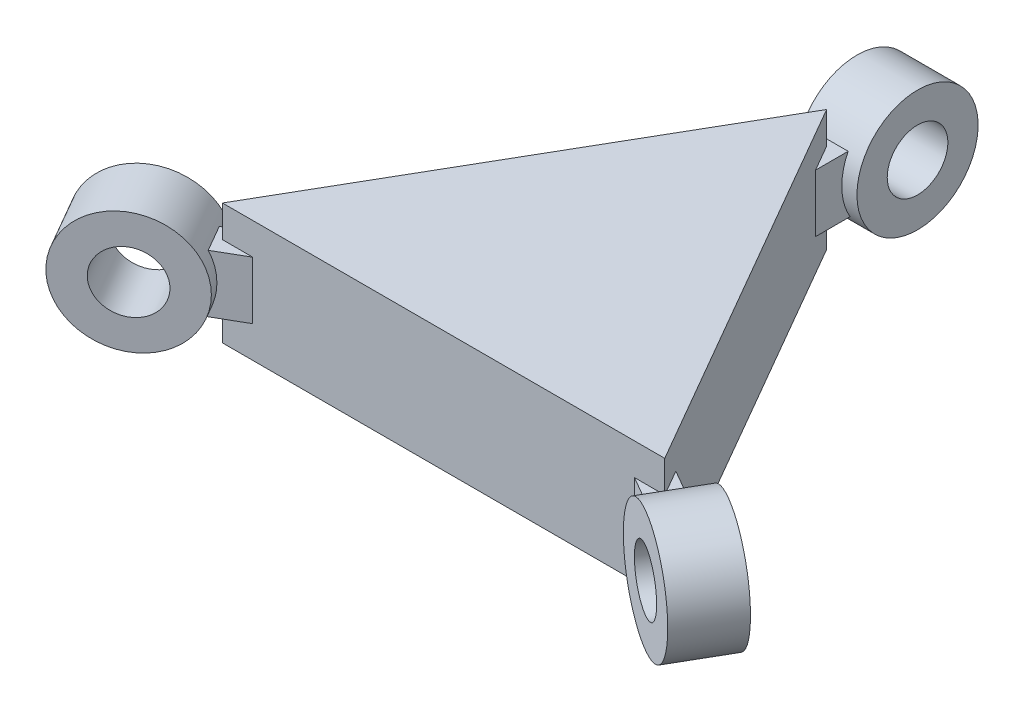
ISO-10303-21;
HEADER;
FILE_DESCRIPTION(('STEP AP214'),'2;1');
FILE_NAME('part.step','',(''),(''),'','','');
FILE_SCHEMA(('AUTOMOTIVE_DESIGN { 1 0 10303 214 1 1 1 1 }'));
ENDSEC;
DATA;
#1=APPLICATION_CONTEXT('core data for automotive mechanical design processes');
#2=APPLICATION_PROTOCOL_DEFINITION('international standard','automotive_design',2000,#1);
#3=PRODUCT_CONTEXT('',#1,'mechanical');
#4=PRODUCT('Part','Part','',(#3));
#5=PRODUCT_RELATED_PRODUCT_CATEGORY('part','',(#4));
#6=PRODUCT_DEFINITION_FORMATION('','',#4);
#7=PRODUCT_DEFINITION_CONTEXT('part definition',#1,'design');
#8=PRODUCT_DEFINITION('design','',#6,#7);
#9=PRODUCT_DEFINITION_SHAPE('','',#8);
#10=(LENGTH_UNIT() NAMED_UNIT(*) SI_UNIT(.MILLI.,.METRE.));
#11=(NAMED_UNIT(*) PLANE_ANGLE_UNIT() SI_UNIT($,.RADIAN.));
#12=(NAMED_UNIT(*) SI_UNIT($,.STERADIAN.) SOLID_ANGLE_UNIT());
#13=UNCERTAINTY_MEASURE_WITH_UNIT(LENGTH_MEASURE(1.E-05),#10,'distance_accuracy_value','');
#14=(GEOMETRIC_REPRESENTATION_CONTEXT(3) GLOBAL_UNCERTAINTY_ASSIGNED_CONTEXT((#13)) GLOBAL_UNIT_ASSIGNED_CONTEXT((#10,
#11,#12)) REPRESENTATION_CONTEXT('',''));
#15=CARTESIAN_POINT('',(0.,0.,0.));
#16=DIRECTION('',(0.,0.,1.));
#17=DIRECTION('',(1.,0.,0.));
#18=AXIS2_PLACEMENT_3D('',#15,#16,#17);
#19=CARTESIAN_POINT('',(0.,20.,-69.9999999999994));
#20=DIRECTION('',(0.866025403784436,0.,0.500000000000004));
#21=DIRECTION('',(0.500000000000004,0.,-0.866025403784436));
#22=AXIS2_PLACEMENT_3D('',#19,#20,#21);
#23=PLANE('',#22);
#24=DIRECTION('',(0.,1.,0.));
#25=VECTOR('',#24,1.);
#26=CARTESIAN_POINT('',(-33.9999999999997,20.,-11.1102725426589));
#27=LINE('',#26,#25);
#28=CARTESIAN_POINT('',(-33.9999999999997,5.24611498566727,-11.1102725426589));
#29=VERTEX_POINT('',#28);
#30=CARTESIAN_POINT('',(-33.9999999999997,14.7538850143327,-11.1102725426589));
#31=VERTEX_POINT('',#30);
#32=EDGE_CURVE('E12',#29,#31,#27,.T.);
#33=ORIENTED_EDGE('',*,*,#32,.T.);
#34=DIRECTION('',(-0.500000000000004,0.,0.866025403784436));
#35=VECTOR('',#34,1.);
#36=CARTESIAN_POINT('',(0.,14.7538850143327,-69.9999999999994));
#37=LINE('',#36,#35);
#38=CARTESIAN_POINT('',(-36.4999999999999,14.7538850143327,-6.78014552373624));
#39=VERTEX_POINT('',#38);
#40=EDGE_CURVE('E234',#31,#39,#37,.T.);
#41=ORIENTED_EDGE('',*,*,#40,.T.);
#42=DIRECTION('',(0.,-1.,0.));
#43=VECTOR('',#42,1.);
#44=CARTESIAN_POINT('',(-36.4999999999999,20.,-6.78014552373624));
#45=LINE('',#44,#43);
#46=CARTESIAN_POINT('',(-36.4999999999999,20.,-6.78014552373624));
#47=VERTEX_POINT('',#46);
#48=EDGE_CURVE('E348',#47,#39,#45,.T.);
#49=ORIENTED_EDGE('',*,*,#48,.F.);
#50=DIRECTION('',(-0.500000000000004,0.,0.866025403784436));
#51=VECTOR('',#50,1.);
#52=CARTESIAN_POINT('',(0.,20.,-69.9999999999994));
#53=LINE('',#52,#51);
#54=CARTESIAN_POINT('',(0.,20.,-69.9999999999994));
#55=VERTEX_POINT('',#54);
#56=EDGE_CURVE('E324',#55,#47,#53,.T.);
#57=ORIENTED_EDGE('',*,*,#56,.F.);
#58=DIRECTION('',(0.,-1.,0.));
#59=VECTOR('',#58,1.);
#60=CARTESIAN_POINT('',(0.,20.,-69.9999999999994));
#61=LINE('',#60,#59);
#62=CARTESIAN_POINT('',(0.,14.7538850143327,-69.9999999999995));
#63=VERTEX_POINT('',#62);
#64=EDGE_CURVE('E340',#55,#63,#61,.T.);
#65=ORIENTED_EDGE('',*,*,#64,.T.);
#66=DIRECTION('',(-0.500000000000004,0.,0.866025403784436));
#67=VECTOR('',#66,1.);
#68=CARTESIAN_POINT('',(0.,14.7538850143327,-69.9999999999994));
#69=LINE('',#68,#67);
#70=CARTESIAN_POINT('',(-2.5,14.7538850143327,-65.6698729810773));
#71=VERTEX_POINT('',#70);
#72=EDGE_CURVE('E320',#63,#71,#69,.T.);
#73=ORIENTED_EDGE('',*,*,#72,.T.);
#74=DIRECTION('',(0.,-1.,0.));
#75=VECTOR('',#74,1.);
#76=CARTESIAN_POINT('',(-2.5,20.,-65.6698729810773));
#77=LINE('',#76,#75);
#78=CARTESIAN_POINT('',(-2.5,5.24611498566727,-65.6698729810773));
#79=VERTEX_POINT('',#78);
#80=EDGE_CURVE('E360',#71,#79,#77,.T.);
#81=ORIENTED_EDGE('',*,*,#80,.T.);
#82=DIRECTION('',(0.500000000000004,0.,-0.866025403784436));
#83=VECTOR('',#82,1.);
#84=CARTESIAN_POINT('',(0.,5.24611498566727,-69.9999999999994));
#85=LINE('',#84,#83);
#86=CARTESIAN_POINT('',(0.,5.24611498566727,-69.9999999999995));
#87=VERTEX_POINT('',#86);
#88=EDGE_CURVE('E317',#79,#87,#85,.T.);
#89=ORIENTED_EDGE('',*,*,#88,.T.);
#90=CARTESIAN_POINT('',(0.,0.,-69.9999999999994));
#91=VERTEX_POINT('',#90);
#92=EDGE_CURVE('E332',#87,#91,#61,.T.);
#93=ORIENTED_EDGE('',*,*,#92,.T.);
#94=DIRECTION('',(-0.500000000000004,0.,0.866025403784436));
#95=VECTOR('',#94,1.);
#96=CARTESIAN_POINT('',(0.,0.,-69.9999999999994));
#97=LINE('',#96,#95);
#98=CARTESIAN_POINT('',(-36.4999999999999,0.,-6.78014552373624));
#99=VERTEX_POINT('',#98);
#100=EDGE_CURVE('E323',#91,#99,#97,.T.);
#101=ORIENTED_EDGE('',*,*,#100,.T.);
#102=CARTESIAN_POINT('',(-36.4999999999999,5.24611498566727,-6.78014552373624));
#103=VERTEX_POINT('',#102);
#104=EDGE_CURVE('E347',#103,#99,#45,.T.);
#105=ORIENTED_EDGE('',*,*,#104,.F.);
#106=DIRECTION('',(0.500000000000004,0.,-0.866025403784436));
#107=VECTOR('',#106,1.);
#108=CARTESIAN_POINT('',(0.,5.24611498566727,-69.9999999999994));
#109=LINE('',#108,#107);
#110=EDGE_CURVE('E54',#103,#29,#109,.T.);
#111=ORIENTED_EDGE('',*,*,#110,.T.);
#112=EDGE_LOOP('',(#33,#41,#49,#57,#65,#73,#81,#89,#93,#101,#105,#111));
#113=FACE_BOUND('',#112,.T.);
#114=ADVANCED_FACE('F40',(#113),#23,.F.);
#115=CARTESIAN_POINT('',(-36.4999999999999,20.,-6.78014552373624));
#116=DIRECTION('',(0.,0.,-1.));
#117=DIRECTION('',(-1.,0.,0.));
#118=AXIS2_PLACEMENT_3D('',#115,#116,#117);
#119=PLANE('',#118);
#120=ORIENTED_EDGE('',*,*,#48,.T.);
#121=DIRECTION('',(1.,0.,0.));
#122=VECTOR('',#121,1.);
#123=CARTESIAN_POINT('',(-36.4999999999999,14.7538850143327,-6.78014552373624));
#124=LINE('',#123,#122);
#125=CARTESIAN_POINT('',(-31.5000000000004,14.7538850143327,-6.78014552373624));
#126=VERTEX_POINT('',#125);
#127=EDGE_CURVE('E47',#39,#126,#124,.T.);
#128=ORIENTED_EDGE('',*,*,#127,.T.);
#129=DIRECTION('',(0.,1.,0.));
#130=VECTOR('',#129,1.);
#131=CARTESIAN_POINT('',(-31.5000000000004,20.,-6.78014552373624));
#132=LINE('',#131,#130);
#133=CARTESIAN_POINT('',(-31.5000000000004,5.24611498566727,-6.78014552373624));
#134=VERTEX_POINT('',#133);
#135=EDGE_CURVE('E375',#134,#126,#132,.T.);
#136=ORIENTED_EDGE('',*,*,#135,.F.);
#137=DIRECTION('',(-1.,0.,0.));
#138=VECTOR('',#137,1.);
#139=CARTESIAN_POINT('',(-36.4999999999999,5.24611498566727,-6.78014552373624));
#140=LINE('',#139,#138);
#141=EDGE_CURVE('E373',#134,#103,#140,.T.);
#142=ORIENTED_EDGE('',*,*,#141,.T.);
#143=ORIENTED_EDGE('',*,*,#104,.T.);
#144=DIRECTION('',(1.,0.,0.));
#145=VECTOR('',#144,1.);
#146=CARTESIAN_POINT('',(-36.4999999999999,0.,-6.78014552373624));
#147=LINE('',#146,#145);
#148=CARTESIAN_POINT('',(36.5000000000001,0.,-6.78014552373624));
#149=VERTEX_POINT('',#148);
#150=EDGE_CURVE('E335',#99,#149,#147,.T.);
#151=ORIENTED_EDGE('',*,*,#150,.T.);
#152=DIRECTION('',(0.,-1.,0.));
#153=VECTOR('',#152,1.);
#154=CARTESIAN_POINT('',(36.5000000000001,20.,-6.78014552373624));
#155=LINE('',#154,#153);
#156=CARTESIAN_POINT('',(36.5000000000001,5.24611498566727,-6.78014552373624));
#157=VERTEX_POINT('',#156);
#158=EDGE_CURVE('E343',#157,#149,#155,.T.);
#159=ORIENTED_EDGE('',*,*,#158,.F.);
#160=DIRECTION('',(-1.,0.,0.));
#161=VECTOR('',#160,1.);
#162=CARTESIAN_POINT('',(-36.4999999999999,5.24611498566727,-6.78014552373624));
#163=LINE('',#162,#161);
#164=CARTESIAN_POINT('',(31.5000000000004,5.24611498566727,-6.78014552373624));
#165=VERTEX_POINT('',#164);
#166=EDGE_CURVE('E62',#157,#165,#163,.T.);
#167=ORIENTED_EDGE('',*,*,#166,.T.);
#168=DIRECTION('',(0.,-1.,0.));
#169=VECTOR('',#168,1.);
#170=CARTESIAN_POINT('',(31.5000000000004,20.,-6.78014552373624));
#171=LINE('',#170,#169);
#172=CARTESIAN_POINT('',(31.5000000000004,14.7538850143327,-6.78014552373624));
#173=VERTEX_POINT('',#172);
#174=EDGE_CURVE('E371',#173,#165,#171,.T.);
#175=ORIENTED_EDGE('',*,*,#174,.F.);
#176=DIRECTION('',(1.,0.,0.));
#177=VECTOR('',#176,1.);
#178=CARTESIAN_POINT('',(-36.4999999999999,14.7538850143327,-6.78014552373624));
#179=LINE('',#178,#177);
#180=CARTESIAN_POINT('',(36.5000000000001,14.7538850143327,-6.78014552373624));
#181=VERTEX_POINT('',#180);
#182=EDGE_CURVE('E276',#173,#181,#179,.T.);
#183=ORIENTED_EDGE('',*,*,#182,.T.);
#184=CARTESIAN_POINT('',(36.5000000000001,20.,-6.78014552373624));
#185=VERTEX_POINT('',#184);
#186=EDGE_CURVE('E344',#185,#181,#155,.T.);
#187=ORIENTED_EDGE('',*,*,#186,.F.);
#188=DIRECTION('',(1.,0.,0.));
#189=VECTOR('',#188,1.);
#190=CARTESIAN_POINT('',(-36.4999999999999,20.,-6.78014552373624));
#191=LINE('',#190,#189);
#192=EDGE_CURVE('E327',#47,#185,#191,.T.);
#193=ORIENTED_EDGE('',*,*,#192,.F.);
#194=EDGE_LOOP('',(#120,#128,#136,#142,#143,#151,#159,#167,#175,#183,#187,#193));
#195=FACE_BOUND('',#194,.T.);
#196=ADVANCED_FACE('F379',(#195),#119,.F.);
#197=CARTESIAN_POINT('',(36.5000000000001,20.,-6.78014552373624));
#198=DIRECTION('',(-0.866025403784435,0.,0.500000000000006));
#199=DIRECTION('',(0.500000000000006,0.,0.866025403784435));
#200=AXIS2_PLACEMENT_3D('',#197,#198,#199);
#201=PLANE('',#200);
#202=ORIENTED_EDGE('',*,*,#186,.T.);
#203=DIRECTION('',(-0.500000000000006,0.,-0.866025403784435));
#204=VECTOR('',#203,1.);
#205=CARTESIAN_POINT('',(36.5000000000001,14.7538850143327,-6.78014552373624));
#206=LINE('',#205,#204);
#207=CARTESIAN_POINT('',(33.9999999999999,14.7538850143327,-11.1102725426587));
#208=VERTEX_POINT('',#207);
#209=EDGE_CURVE('E368',#181,#208,#206,.T.);
#210=ORIENTED_EDGE('',*,*,#209,.T.);
#211=DIRECTION('',(0.,-1.,0.));
#212=VECTOR('',#211,1.);
#213=CARTESIAN_POINT('',(33.9999999999999,20.,-11.1102725426587));
#214=LINE('',#213,#212);
#215=CARTESIAN_POINT('',(33.9999999999999,5.24611498566727,-11.1102725426587));
#216=VERTEX_POINT('',#215);
#217=EDGE_CURVE('E365',#208,#216,#214,.T.);
#218=ORIENTED_EDGE('',*,*,#217,.T.);
#219=DIRECTION('',(0.500000000000006,0.,0.866025403784435));
#220=VECTOR('',#219,1.);
#221=CARTESIAN_POINT('',(36.5000000000001,5.24611498566727,-6.78014552373624));
#222=LINE('',#221,#220);
#223=EDGE_CURVE('E363',#216,#157,#222,.T.);
#224=ORIENTED_EDGE('',*,*,#223,.T.);
#225=ORIENTED_EDGE('',*,*,#158,.T.);
#226=DIRECTION('',(-0.500000000000006,0.,-0.866025403784435));
#227=VECTOR('',#226,1.);
#228=CARTESIAN_POINT('',(36.5000000000001,0.,-6.78014552373624));
#229=LINE('',#228,#227);
#230=EDGE_CURVE('E328',#149,#91,#229,.T.);
#231=ORIENTED_EDGE('',*,*,#230,.T.);
#232=ORIENTED_EDGE('',*,*,#92,.F.);
#233=DIRECTION('',(0.500000000000006,0.,0.866025403784435));
#234=VECTOR('',#233,1.);
#235=CARTESIAN_POINT('',(36.5000000000001,5.24611498566727,-6.78014552373624));
#236=LINE('',#235,#234);
#237=CARTESIAN_POINT('',(2.5,5.24611498566727,-65.6698729810773));
#238=VERTEX_POINT('',#237);
#239=EDGE_CURVE('E351',#87,#238,#236,.T.);
#240=ORIENTED_EDGE('',*,*,#239,.T.);
#241=DIRECTION('',(0.,-1.,0.));
#242=VECTOR('',#241,1.);
#243=CARTESIAN_POINT('',(2.5,20.,-65.6698729810773));
#244=LINE('',#243,#242);
#245=CARTESIAN_POINT('',(2.49999999999999,14.7538850143327,-65.6698729810773));
#246=VERTEX_POINT('',#245);
#247=EDGE_CURVE('E354',#246,#238,#244,.T.);
#248=ORIENTED_EDGE('',*,*,#247,.F.);
#249=DIRECTION('',(-0.500000000000006,0.,-0.866025403784435));
#250=VECTOR('',#249,1.);
#251=CARTESIAN_POINT('',(36.5000000000001,14.7538850143327,-6.78014552373624));
#252=LINE('',#251,#250);
#253=EDGE_CURVE('E357',#246,#63,#252,.T.);
#254=ORIENTED_EDGE('',*,*,#253,.T.);
#255=ORIENTED_EDGE('',*,*,#64,.F.);
#256=DIRECTION('',(-0.500000000000006,0.,-0.866025403784435));
#257=VECTOR('',#256,1.);
#258=CARTESIAN_POINT('',(36.5000000000001,20.,-6.78014552373624));
#259=LINE('',#258,#257);
#260=EDGE_CURVE('E330',#185,#55,#259,.T.);
#261=ORIENTED_EDGE('',*,*,#260,.F.);
#262=EDGE_LOOP('',(#202,#210,#218,#224,#225,#231,#232,#240,#248,#254,#255,#261));
#263=FACE_BOUND('',#262,.T.);
#264=ADVANCED_FACE('F396',(#263),#201,.F.);
#265=CARTESIAN_POINT('',(0.,20.,0.));
#266=DIRECTION('',(0.,1.,0.));
#267=DIRECTION('',(0.,0.,1.));
#268=AXIS2_PLACEMENT_3D('',#265,#266,#267);
#269=PLANE('',#268);
#270=ORIENTED_EDGE('',*,*,#56,.T.);
#271=ORIENTED_EDGE('',*,*,#192,.T.);
#272=ORIENTED_EDGE('',*,*,#260,.T.);
#273=EDGE_LOOP('',(#270,#271,#272));
#274=FACE_BOUND('',#273,.T.);
#275=ADVANCED_FACE('F422',(#274),#269,.T.);
#276=CARTESIAN_POINT('',(0.,0.,0.));
#277=DIRECTION('',(0.,1.,0.));
#278=DIRECTION('',(0.,0.,1.));
#279=AXIS2_PLACEMENT_3D('',#276,#277,#278);
#280=PLANE('',#279);
#281=ORIENTED_EDGE('',*,*,#100,.F.);
#282=ORIENTED_EDGE('',*,*,#230,.F.);
#283=ORIENTED_EDGE('',*,*,#150,.F.);
#284=EDGE_LOOP('',(#281,#282,#283));
#285=FACE_BOUND('',#284,.T.);
#286=ADVANCED_FACE('F393',(#285),#280,.F.);
#287=CARTESIAN_POINT('',(-2.5,0.,0.));
#288=DIRECTION('',(-1.,0.,0.));
#289=DIRECTION('',(0.,0.,1.));
#290=AXIS2_PLACEMENT_3D('',#287,#288,#289);
#291=PLANE('',#290);
#292=ORIENTED_EDGE('',*,*,#80,.F.);
#293=DIRECTION('',(0.,0.,-1.));
#294=VECTOR('',#293,1.);
#295=CARTESIAN_POINT('',(-2.5,14.7538850143327,-71.3478751393043));
#296=LINE('',#295,#294);
#297=CARTESIAN_POINT('',(-2.5,14.7538850143327,-71.0529300451838));
#298=VERTEX_POINT('',#297);
#299=EDGE_CURVE('E284',#71,#298,#296,.T.);
#300=ORIENTED_EDGE('',*,*,#299,.T.);
#301=CARTESIAN_POINT('',(-2.5,10.2873495310263,-79.9999999999994));
#302=DIRECTION('',(-1.,0.,0.));
#303=DIRECTION('',(0.,0.,1.));
#304=AXIS2_PLACEMENT_3D('',#301,#302,#303);
#305=CIRCLE('',#304,10.);
#306=CARTESIAN_POINT('',(-2.5,5.27329574242958,-71.3478751393043));
#307=VERTEX_POINT('',#306);
#308=EDGE_CURVE('E307',#298,#307,#305,.F.);
#309=ORIENTED_EDGE('',*,*,#308,.T.);
#310=DIRECTION('',(0.,-1.,0.));
#311=VECTOR('',#310,1.);
#312=CARTESIAN_POINT('',(-2.5,14.7538850143327,-71.3478751393043));
#313=LINE('',#312,#311);
#314=CARTESIAN_POINT('',(-2.5,5.24611498566727,-71.3478751393043));
#315=VERTEX_POINT('',#314);
#316=EDGE_CURVE('E279',#307,#315,#313,.T.);
#317=ORIENTED_EDGE('',*,*,#316,.T.);
#318=DIRECTION('',(0.,0.,1.));
#319=VECTOR('',#318,1.);
#320=CARTESIAN_POINT('',(-2.5,5.24611498566727,-71.3478751393043));
#321=LINE('',#320,#319);
#322=EDGE_CURVE('E281',#315,#79,#321,.T.);
#323=ORIENTED_EDGE('',*,*,#322,.T.);
#324=EDGE_LOOP('',(#292,#300,#309,#317,#323));
#325=FACE_BOUND('',#324,.T.);
#326=ADVANCED_FACE('F444',(#325),#291,.T.);
#327=CARTESIAN_POINT('',(2.5,0.,0.));
#328=DIRECTION('',(-1.,0.,0.));
#329=DIRECTION('',(0.,0.,1.));
#330=AXIS2_PLACEMENT_3D('',#327,#328,#329);
#331=PLANE('',#330);
#332=DIRECTION('',(0.,0.,-1.));
#333=VECTOR('',#332,1.);
#334=CARTESIAN_POINT('',(2.5,14.7538850143327,-71.3478751393043));
#335=LINE('',#334,#333);
#336=CARTESIAN_POINT('',(2.5,14.7538850143327,-71.0529300451838));
#337=VERTEX_POINT('',#336);
#338=EDGE_CURVE('E290',#246,#337,#335,.T.);
#339=ORIENTED_EDGE('',*,*,#338,.F.);
#340=ORIENTED_EDGE('',*,*,#247,.T.);
#341=DIRECTION('',(0.,0.,1.));
#342=VECTOR('',#341,1.);
#343=CARTESIAN_POINT('',(2.5,5.24611498566727,-71.3478751393043));
#344=LINE('',#343,#342);
#345=CARTESIAN_POINT('',(2.5,5.24611498566727,-71.3478751393043));
#346=VERTEX_POINT('',#345);
#347=EDGE_CURVE('E288',#346,#238,#344,.T.);
#348=ORIENTED_EDGE('',*,*,#347,.F.);
#349=DIRECTION('',(0.,-1.,0.));
#350=VECTOR('',#349,1.);
#351=CARTESIAN_POINT('',(2.5,14.7538850143327,-71.3478751393043));
#352=LINE('',#351,#350);
#353=CARTESIAN_POINT('',(2.5,5.27329574242958,-71.3478751393043));
#354=VERTEX_POINT('',#353);
#355=EDGE_CURVE('E286',#354,#346,#352,.T.);
#356=ORIENTED_EDGE('',*,*,#355,.F.);
#357=CARTESIAN_POINT('',(2.5,10.2873495310263,-79.9999999999994));
#358=DIRECTION('',(-1.,0.,0.));
#359=DIRECTION('',(0.,0.,1.));
#360=AXIS2_PLACEMENT_3D('',#357,#358,#359);
#361=CIRCLE('',#360,10.);
#362=EDGE_CURVE('E315',#337,#354,#361,.F.);
#363=ORIENTED_EDGE('',*,*,#362,.F.);
#364=EDGE_LOOP('',(#339,#340,#348,#356,#363));
#365=FACE_BOUND('',#364,.T.);
#366=ADVANCED_FACE('F431',(#365),#331,.F.);
#367=CARTESIAN_POINT('',(2.5,14.7538850143327,-71.3478751393043));
#368=DIRECTION('',(0.,1.,0.));
#369=DIRECTION('',(0.,0.,1.));
#370=AXIS2_PLACEMENT_3D('',#367,#368,#369);
#371=PLANE('',#370);
#372=ORIENTED_EDGE('',*,*,#72,.F.);
#373=ORIENTED_EDGE('',*,*,#253,.F.);
#374=ORIENTED_EDGE('',*,*,#338,.T.);
#375=DIRECTION('',(-1.,0.,0.));
#376=VECTOR('',#375,1.);
#377=CARTESIAN_POINT('',(5.,14.7538850143327,-71.0529300451838));
#378=LINE('',#377,#376);
#379=EDGE_CURVE('E309',#337,#298,#378,.T.);
#380=ORIENTED_EDGE('',*,*,#379,.T.);
#381=ORIENTED_EDGE('',*,*,#299,.F.);
#382=EDGE_LOOP('',(#372,#373,#374,#380,#381));
#383=FACE_BOUND('',#382,.T.);
#384=ADVANCED_FACE('F426',(#383),#371,.T.);
#385=CARTESIAN_POINT('',(2.5,5.24611498566727,-71.3478751393043));
#386=DIRECTION('',(0.,-1.,0.));
#387=DIRECTION('',(0.,0.,-1.));
#388=AXIS2_PLACEMENT_3D('',#385,#386,#387);
#389=PLANE('',#388);
#390=ORIENTED_EDGE('',*,*,#88,.F.);
#391=ORIENTED_EDGE('',*,*,#322,.F.);
#392=DIRECTION('',(-1.,0.,0.));
#393=VECTOR('',#392,1.);
#394=CARTESIAN_POINT('',(2.5,5.24611498566727,-71.3478751393043));
#395=LINE('',#394,#393);
#396=EDGE_CURVE('E292',#346,#315,#395,.T.);
#397=ORIENTED_EDGE('',*,*,#396,.F.);
#398=ORIENTED_EDGE('',*,*,#347,.T.);
#399=ORIENTED_EDGE('',*,*,#239,.F.);
#400=EDGE_LOOP('',(#390,#391,#397,#398,#399));
#401=FACE_BOUND('',#400,.T.);
#402=ADVANCED_FACE('F446',(#401),#389,.T.);
#403=CARTESIAN_POINT('',(5.,10.2873495310263,-79.9999999999994));
#404=DIRECTION('',(-1.,0.,0.));
#405=DIRECTION('',(0.,0.,1.));
#406=AXIS2_PLACEMENT_3D('',#403,#404,#405);
#407=CYLINDRICAL_SURFACE('',#406,10.);
#408=CARTESIAN_POINT('',(5.,10.2873495310263,-79.9999999999994));
#409=DIRECTION('',(-1.,0.,0.));
#410=DIRECTION('',(0.,0.,1.));
#411=AXIS2_PLACEMENT_3D('',#408,#409,#410);
#412=CIRCLE('',#411,10.);
#413=CARTESIAN_POINT('',(5.,10.2873495310263,-69.9999999999994));
#414=VERTEX_POINT('',#413);
#415=EDGE_CURVE('E304',#414,#414,#412,.T.);
#416=ORIENTED_EDGE('',*,*,#415,.T.);
#417=EDGE_LOOP('',(#416));
#418=FACE_BOUND('',#417,.T.);
#419=CARTESIAN_POINT('',(-5.,10.2873495310263,-79.9999999999994));
#420=DIRECTION('',(-1.,0.,0.));
#421=DIRECTION('',(0.,0.,1.));
#422=AXIS2_PLACEMENT_3D('',#419,#420,#421);
#423=CIRCLE('',#422,10.);
#424=CARTESIAN_POINT('',(-5.,10.2873495310263,-69.9999999999994));
#425=VERTEX_POINT('',#424);
#426=EDGE_CURVE('E298',#425,#425,#423,.T.);
#427=ORIENTED_EDGE('',*,*,#426,.F.);
#428=EDGE_LOOP('',(#427));
#429=FACE_BOUND('',#428,.T.);
#430=ORIENTED_EDGE('',*,*,#362,.T.);
#431=DIRECTION('',(-1.,0.,0.));
#432=VECTOR('',#431,1.);
#433=CARTESIAN_POINT('',(5.,5.27329574242958,-71.3478751393043));
#434=LINE('',#433,#432);
#435=EDGE_CURVE('E312',#307,#354,#434,.F.);
#436=ORIENTED_EDGE('',*,*,#435,.F.);
#437=ORIENTED_EDGE('',*,*,#308,.F.);
#438=ORIENTED_EDGE('',*,*,#379,.F.);
#439=EDGE_LOOP('',(#430,#436,#437,#438));
#440=FACE_BOUND('',#439,.T.);
#441=ADVANCED_FACE('F436',(#418,#429,#440),#407,.T.);
#442=CARTESIAN_POINT('',(5.,10.2873495310263,-79.9999999999994));
#443=DIRECTION('',(-1.,0.,0.));
#444=DIRECTION('',(0.,0.,1.));
#445=AXIS2_PLACEMENT_3D('',#442,#443,#444);
#446=PLANE('',#445);
#447=CARTESIAN_POINT('',(5.,10.2873495310263,-79.9999999999994));
#448=DIRECTION('',(-1.,0.,0.));
#449=DIRECTION('',(0.,0.,1.));
#450=AXIS2_PLACEMENT_3D('',#447,#448,#449);
#451=CIRCLE('',#450,5.);
#452=CARTESIAN_POINT('',(5.,10.2873495310263,-74.9999999999994));
#453=VERTEX_POINT('',#452);
#454=EDGE_CURVE('E301',#453,#453,#451,.T.);
#455=ORIENTED_EDGE('',*,*,#454,.T.);
#456=EDGE_LOOP('',(#455));
#457=FACE_BOUND('',#456,.T.);
#458=ORIENTED_EDGE('',*,*,#415,.F.);
#459=EDGE_LOOP('',(#458));
#460=FACE_BOUND('',#459,.T.);
#461=ADVANCED_FACE('F453',(#457,#460),#446,.F.);
#462=CARTESIAN_POINT('',(5.,10.2873495310263,-79.9999999999994));
#463=DIRECTION('',(-1.,0.,0.));
#464=DIRECTION('',(0.,0.,1.));
#465=AXIS2_PLACEMENT_3D('',#462,#463,#464);
#466=CYLINDRICAL_SURFACE('',#465,5.);
#467=ORIENTED_EDGE('',*,*,#454,.F.);
#468=EDGE_LOOP('',(#467));
#469=FACE_BOUND('',#468,.T.);
#470=CARTESIAN_POINT('',(-5.,10.2873495310263,-79.9999999999994));
#471=DIRECTION('',(-1.,0.,0.));
#472=DIRECTION('',(0.,0.,1.));
#473=AXIS2_PLACEMENT_3D('',#470,#471,#472);
#474=CIRCLE('',#473,5.);
#475=CARTESIAN_POINT('',(-5.,10.2873495310263,-74.9999999999994));
#476=VERTEX_POINT('',#475);
#477=EDGE_CURVE('E295',#476,#476,#474,.T.);
#478=ORIENTED_EDGE('',*,*,#477,.T.);
#479=EDGE_LOOP('',(#478));
#480=FACE_BOUND('',#479,.T.);
#481=ADVANCED_FACE('F473',(#469,#480),#466,.F.);
#482=CARTESIAN_POINT('',(-5.,10.2873495310263,-79.9999999999994));
#483=DIRECTION('',(-1.,0.,0.));
#484=DIRECTION('',(0.,0.,1.));
#485=AXIS2_PLACEMENT_3D('',#482,#483,#484);
#486=PLANE('',#485);
#487=ORIENTED_EDGE('',*,*,#426,.T.);
#488=EDGE_LOOP('',(#487));
#489=FACE_BOUND('',#488,.T.);
#490=ORIENTED_EDGE('',*,*,#477,.F.);
#491=EDGE_LOOP('',(#490));
#492=FACE_BOUND('',#491,.T.);
#493=ADVANCED_FACE('F477',(#489,#492),#486,.T.);
#494=CARTESIAN_POINT('',(2.5,14.7538850143327,-71.3478751393043));
#495=DIRECTION('',(0.,0.,-1.));
#496=DIRECTION('',(-1.,0.,0.));
#497=AXIS2_PLACEMENT_3D('',#494,#495,#496);
#498=PLANE('',#497);
#499=ORIENTED_EDGE('',*,*,#316,.F.);
#500=ORIENTED_EDGE('',*,*,#435,.T.);
#501=ORIENTED_EDGE('',*,*,#355,.T.);
#502=ORIENTED_EDGE('',*,*,#396,.T.);
#503=EDGE_LOOP('',(#499,#500,#501,#502));
#504=FACE_BOUND('',#503,.T.);
#505=ADVANCED_FACE('F440',(#504),#498,.T.);
#506=CARTESIAN_POINT('',(-25.3743157584745,0.,-39.6165470368665));
#507=DIRECTION('',(0.499999999999989,0.,-0.866025403784445));
#508=DIRECTION('',(-0.866025403784445,0.,-0.499999999999989));
#509=AXIS2_PLACEMENT_3D('',#506,#507,#508);
#510=PLANE('',#509);
#511=DIRECTION('',(0.866025403784445,0.,0.499999999999989));
#512=VECTOR('',#511,1.);
#513=CARTESIAN_POINT('',(36.4147566182036,14.7538850143327,-3.94260946721517));
#514=LINE('',#513,#512);
#515=CARTESIAN_POINT('',(36.1593266739737,14.7538850143327,-4.09008201427541));
#516=VERTEX_POINT('',#515);
#517=EDGE_CURVE('E248',#173,#516,#514,.T.);
#518=ORIENTED_EDGE('',*,*,#517,.F.);
#519=ORIENTED_EDGE('',*,*,#174,.T.);
#520=DIRECTION('',(-0.866025403784445,0.,-0.499999999999989));
#521=VECTOR('',#520,1.);
#522=CARTESIAN_POINT('',(36.4147566182036,5.24611498566727,-3.94260946721517));
#523=LINE('',#522,#521);
#524=CARTESIAN_POINT('',(36.4147566182036,5.24611498566727,-3.94260946721517));
#525=VERTEX_POINT('',#524);
#526=EDGE_CURVE('E246',#525,#165,#523,.T.);
#527=ORIENTED_EDGE('',*,*,#526,.F.);
#528=DIRECTION('',(0.,-1.,0.));
#529=VECTOR('',#528,1.);
#530=CARTESIAN_POINT('',(36.4147566182036,14.7538850143327,-3.94260946721517));
#531=LINE('',#530,#529);
#532=CARTESIAN_POINT('',(36.4147566182036,5.27329574242958,-3.94260946721517));
#533=VERTEX_POINT('',#532);
#534=EDGE_CURVE('E244',#533,#525,#531,.T.);
#535=ORIENTED_EDGE('',*,*,#534,.F.);
#536=CARTESIAN_POINT('',(43.9077165442806,10.2873495310263,0.383452963132302));
#537=DIRECTION('',(0.499999999999989,0.,-0.866025403784445));
#538=DIRECTION('',(-0.866025403784445,0.,-0.499999999999989));
#539=AXIS2_PLACEMENT_3D('',#536,#537,#538);
#540=CIRCLE('',#539,10.);
#541=EDGE_CURVE('E273',#516,#533,#540,.F.);
#542=ORIENTED_EDGE('',*,*,#541,.F.);
#543=EDGE_LOOP('',(#518,#519,#527,#535,#542));
#544=FACE_BOUND('',#543,.T.);
#545=ADVANCED_FACE('F402',(#544),#510,.F.);
#546=CARTESIAN_POINT('',(-22.8743157584746,0.,-43.9466740557888));
#547=DIRECTION('',(0.499999999999989,0.,-0.866025403784445));
#548=DIRECTION('',(-0.866025403784445,0.,-0.499999999999989));
#549=AXIS2_PLACEMENT_3D('',#546,#547,#548);
#550=PLANE('',#549);
#551=ORIENTED_EDGE('',*,*,#217,.F.);
#552=DIRECTION('',(0.866025403784445,0.,0.499999999999989));
#553=VECTOR('',#552,1.);
#554=CARTESIAN_POINT('',(38.9147566182036,14.7538850143327,-8.2727364861374));
#555=LINE('',#554,#553);
#556=CARTESIAN_POINT('',(38.6593266739737,14.7538850143327,-8.42020903319764));
#557=VERTEX_POINT('',#556);
#558=EDGE_CURVE('E242',#208,#557,#555,.T.);
#559=ORIENTED_EDGE('',*,*,#558,.T.);
#560=CARTESIAN_POINT('',(46.4077165442805,10.2873495310263,-3.94667405578993));
#561=DIRECTION('',(0.499999999999989,0.,-0.866025403784445));
#562=DIRECTION('',(-0.866025403784445,0.,-0.499999999999989));
#563=AXIS2_PLACEMENT_3D('',#560,#561,#562);
#564=CIRCLE('',#563,10.);
#565=CARTESIAN_POINT('',(38.9147566182036,5.27329574242958,-8.2727364861374));
#566=VERTEX_POINT('',#565);
#567=EDGE_CURVE('E265',#557,#566,#564,.F.);
#568=ORIENTED_EDGE('',*,*,#567,.T.);
#569=DIRECTION('',(0.,-1.,0.));
#570=VECTOR('',#569,1.);
#571=CARTESIAN_POINT('',(38.9147566182036,14.7538850143327,-8.2727364861374));
#572=LINE('',#571,#570);
#573=CARTESIAN_POINT('',(38.9147566182036,5.24611498566727,-8.2727364861374));
#574=VERTEX_POINT('',#573);
#575=EDGE_CURVE('E237',#566,#574,#572,.T.);
#576=ORIENTED_EDGE('',*,*,#575,.T.);
#577=DIRECTION('',(-0.866025403784445,0.,-0.499999999999989));
#578=VECTOR('',#577,1.);
#579=CARTESIAN_POINT('',(38.9147566182036,5.24611498566727,-8.2727364861374));
#580=LINE('',#579,#578);
#581=EDGE_CURVE('E239',#574,#216,#580,.T.);
#582=ORIENTED_EDGE('',*,*,#581,.T.);
#583=EDGE_LOOP('',(#551,#559,#568,#576,#582));
#584=FACE_BOUND('',#583,.T.);
#585=ADVANCED_FACE('F485',(#584),#550,.T.);
#586=CARTESIAN_POINT('',(36.4147566182036,14.7538850143327,-3.94260946721517));
#587=DIRECTION('',(0.,1.,0.));
#588=DIRECTION('',(-0.866025403784445,0.,-0.499999999999989));
#589=AXIS2_PLACEMENT_3D('',#586,#587,#588);
#590=PLANE('',#589);
#591=ORIENTED_EDGE('',*,*,#182,.F.);
#592=ORIENTED_EDGE('',*,*,#517,.T.);
#593=DIRECTION('',(0.499999999999989,0.,-0.866025403784445));
#594=VECTOR('',#593,1.);
#595=CARTESIAN_POINT('',(34.9093266739737,14.7538850143327,-1.92501850481431));
#596=LINE('',#595,#594);
#597=EDGE_CURVE('E267',#516,#557,#596,.T.);
#598=ORIENTED_EDGE('',*,*,#597,.T.);
#599=ORIENTED_EDGE('',*,*,#558,.F.);
#600=ORIENTED_EDGE('',*,*,#209,.F.);
#601=EDGE_LOOP('',(#591,#592,#598,#599,#600));
#602=FACE_BOUND('',#601,.T.);
#603=ADVANCED_FACE('F418',(#602),#590,.T.);
#604=CARTESIAN_POINT('',(36.4147566182036,5.24611498566727,-3.94260946721517));
#605=DIRECTION('',(0.,-1.,0.));
#606=DIRECTION('',(0.866025403784445,0.,0.499999999999989));
#607=AXIS2_PLACEMENT_3D('',#604,#605,#606);
#608=PLANE('',#607);
#609=ORIENTED_EDGE('',*,*,#166,.F.);
#610=ORIENTED_EDGE('',*,*,#223,.F.);
#611=ORIENTED_EDGE('',*,*,#581,.F.);
#612=DIRECTION('',(0.499999999999989,0.,-0.866025403784445));
#613=VECTOR('',#612,1.);
#614=CARTESIAN_POINT('',(36.4147566182036,5.24611498566727,-3.94260946721517));
#615=LINE('',#614,#613);
#616=EDGE_CURVE('E250',#525,#574,#615,.T.);
#617=ORIENTED_EDGE('',*,*,#616,.F.);
#618=ORIENTED_EDGE('',*,*,#526,.T.);
#619=EDGE_LOOP('',(#609,#610,#611,#617,#618));
#620=FACE_BOUND('',#619,.T.);
#621=ADVANCED_FACE('F406',(#620),#608,.T.);
#622=CARTESIAN_POINT('',(42.6577165442806,10.2873495310263,2.54851647259342));
#623=DIRECTION('',(0.499999999999989,0.,-0.866025403784445));
#624=DIRECTION('',(-0.866025403784445,0.,-0.499999999999989));
#625=AXIS2_PLACEMENT_3D('',#622,#623,#624);
#626=CYLINDRICAL_SURFACE('',#625,10.);
#627=CARTESIAN_POINT('',(42.6577165442806,10.2873495310263,2.54851647259342));
#628=DIRECTION('',(0.499999999999989,0.,-0.866025403784445));
#629=DIRECTION('',(-0.866025403784445,0.,-0.499999999999989));
#630=AXIS2_PLACEMENT_3D('',#627,#628,#629);
#631=CIRCLE('',#630,10.);
#632=CARTESIAN_POINT('',(33.9974625064362,10.2873495310263,-2.45148352740647));
#633=VERTEX_POINT('',#632);
#634=EDGE_CURVE('E262',#633,#633,#631,.T.);
#635=ORIENTED_EDGE('',*,*,#634,.T.);
#636=EDGE_LOOP('',(#635));
#637=FACE_BOUND('',#636,.T.);
#638=CARTESIAN_POINT('',(47.6577165442805,10.2873495310263,-6.11173756525103));
#639=DIRECTION('',(0.499999999999989,0.,-0.866025403784445));
#640=DIRECTION('',(-0.866025403784445,0.,-0.499999999999989));
#641=AXIS2_PLACEMENT_3D('',#638,#639,#640);
#642=CIRCLE('',#641,10.);
#643=CARTESIAN_POINT('',(38.9974625064361,10.2873495310263,-11.1117375652509));
#644=VERTEX_POINT('',#643);
#645=EDGE_CURVE('E256',#644,#644,#642,.T.);
#646=ORIENTED_EDGE('',*,*,#645,.F.);
#647=EDGE_LOOP('',(#646));
#648=FACE_BOUND('',#647,.T.);
#649=ORIENTED_EDGE('',*,*,#541,.T.);
#650=DIRECTION('',(0.499999999999989,0.,-0.866025403784445));
#651=VECTOR('',#650,1.);
#652=CARTESIAN_POINT('',(35.1647566182037,5.27329574242958,-1.77754595775407));
#653=LINE('',#652,#651);
#654=EDGE_CURVE('E270',#566,#533,#653,.F.);
#655=ORIENTED_EDGE('',*,*,#654,.F.);
#656=ORIENTED_EDGE('',*,*,#567,.F.);
#657=ORIENTED_EDGE('',*,*,#597,.F.);
#658=EDGE_LOOP('',(#649,#655,#656,#657));
#659=FACE_BOUND('',#658,.T.);
#660=ADVANCED_FACE('F414',(#637,#648,#659),#626,.T.);
#661=CARTESIAN_POINT('',(42.6577165442806,10.2873495310263,2.54851647259342));
#662=DIRECTION('',(0.499999999999989,0.,-0.866025403784445));
#663=DIRECTION('',(-0.866025403784445,0.,-0.499999999999989));
#664=AXIS2_PLACEMENT_3D('',#661,#662,#663);
#665=PLANE('',#664);
#666=CARTESIAN_POINT('',(42.6577165442806,10.2873495310263,2.54851647259342));
#667=DIRECTION('',(0.499999999999989,0.,-0.866025403784445));
#668=DIRECTION('',(-0.866025403784445,0.,-0.499999999999989));
#669=AXIS2_PLACEMENT_3D('',#666,#667,#668);
#670=CIRCLE('',#669,5.);
#671=CARTESIAN_POINT('',(38.3275895253584,10.2873495310263,0.0485164725934771));
#672=VERTEX_POINT('',#671);
#673=EDGE_CURVE('E259',#672,#672,#670,.T.);
#674=ORIENTED_EDGE('',*,*,#673,.T.);
#675=EDGE_LOOP('',(#674));
#676=FACE_BOUND('',#675,.T.);
#677=ORIENTED_EDGE('',*,*,#634,.F.);
#678=EDGE_LOOP('',(#677));
#679=FACE_BOUND('',#678,.T.);
#680=ADVANCED_FACE('F507',(#676,#679),#665,.F.);
#681=CARTESIAN_POINT('',(42.6577165442806,10.2873495310263,2.54851647259342));
#682=DIRECTION('',(0.499999999999989,0.,-0.866025403784445));
#683=DIRECTION('',(-0.866025403784445,0.,-0.499999999999989));
#684=AXIS2_PLACEMENT_3D('',#681,#682,#683);
#685=CYLINDRICAL_SURFACE('',#684,5.);
#686=ORIENTED_EDGE('',*,*,#673,.F.);
#687=EDGE_LOOP('',(#686));
#688=FACE_BOUND('',#687,.T.);
#689=CARTESIAN_POINT('',(47.6577165442805,10.2873495310263,-6.11173756525103));
#690=DIRECTION('',(0.499999999999989,0.,-0.866025403784445));
#691=DIRECTION('',(-0.866025403784445,0.,-0.499999999999989));
#692=AXIS2_PLACEMENT_3D('',#689,#690,#691);
#693=CIRCLE('',#692,5.);
#694=CARTESIAN_POINT('',(43.3275895253583,10.2873495310263,-8.61173756525097));
#695=VERTEX_POINT('',#694);
#696=EDGE_CURVE('E253',#695,#695,#693,.T.);
#697=ORIENTED_EDGE('',*,*,#696,.T.);
#698=EDGE_LOOP('',(#697));
#699=FACE_BOUND('',#698,.T.);
#700=ADVANCED_FACE('F503',(#688,#699),#685,.F.);
#701=CARTESIAN_POINT('',(47.6577165442805,10.2873495310263,-6.11173756525103));
#702=DIRECTION('',(0.499999999999989,0.,-0.866025403784445));
#703=DIRECTION('',(-0.866025403784445,0.,-0.499999999999989));
#704=AXIS2_PLACEMENT_3D('',#701,#702,#703);
#705=PLANE('',#704);
#706=ORIENTED_EDGE('',*,*,#645,.T.);
#707=EDGE_LOOP('',(#706));
#708=FACE_BOUND('',#707,.T.);
#709=ORIENTED_EDGE('',*,*,#696,.F.);
#710=EDGE_LOOP('',(#709));
#711=FACE_BOUND('',#710,.T.);
#712=ADVANCED_FACE('F500',(#708,#711),#705,.T.);
#713=CARTESIAN_POINT('',(36.4147566182036,14.7538850143327,-3.94260946721517));
#714=DIRECTION('',(0.866025403784445,0.,0.499999999999989));
#715=DIRECTION('',(0.499999999999989,0.,-0.866025403784445));
#716=AXIS2_PLACEMENT_3D('',#713,#714,#715);
#717=PLANE('',#716);
#718=ORIENTED_EDGE('',*,*,#575,.F.);
#719=ORIENTED_EDGE('',*,*,#654,.T.);
#720=ORIENTED_EDGE('',*,*,#534,.T.);
#721=ORIENTED_EDGE('',*,*,#616,.T.);
#722=EDGE_LOOP('',(#718,#719,#720,#721));
#723=FACE_BOUND('',#722,.T.);
#724=ADVANCED_FACE('F410',(#723),#717,.T.);
#725=CARTESIAN_POINT('',(22.8743157584746,0.,-43.9466740557888));
#726=DIRECTION('',(-0.499999999999989,0.,-0.866025403784445));
#727=DIRECTION('',(0.866025403784445,0.,-0.499999999999989));
#728=AXIS2_PLACEMENT_3D('',#725,#726,#727);
#729=PLANE('',#728);
#730=ORIENTED_EDGE('',*,*,#32,.F.);
#731=DIRECTION('',(0.866025403784445,0.,-0.499999999999989));
#732=VECTOR('',#731,1.);
#733=CARTESIAN_POINT('',(-38.9147566182036,5.24611498566727,-8.2727364861374));
#734=LINE('',#733,#732);
#735=CARTESIAN_POINT('',(-38.9147566182036,5.24611498566727,-8.2727364861374));
#736=VERTEX_POINT('',#735);
#737=EDGE_CURVE('E186',#736,#29,#734,.T.);
#738=ORIENTED_EDGE('',*,*,#737,.F.);
#739=DIRECTION('',(0.,-1.,0.));
#740=VECTOR('',#739,1.);
#741=CARTESIAN_POINT('',(-38.9147566182036,14.7538850143327,-8.2727364861374));
#742=LINE('',#741,#740);
#743=CARTESIAN_POINT('',(-38.9147566182036,5.27329574242958,-8.2727364861374));
#744=VERTEX_POINT('',#743);
#745=EDGE_CURVE('E195',#744,#736,#742,.T.);
#746=ORIENTED_EDGE('',*,*,#745,.F.);
#747=CARTESIAN_POINT('',(-46.4077165442805,10.2873495310263,-3.94667405578993));
#748=DIRECTION('',(0.499999999999989,0.,0.866025403784445));
#749=DIRECTION('',(0.866025403784445,0.,-0.499999999999989));
#750=AXIS2_PLACEMENT_3D('',#747,#748,#749);
#751=CIRCLE('',#750,10.);
#752=CARTESIAN_POINT('',(-38.6593266739737,14.7538850143327,-8.42020903319764));
#753=VERTEX_POINT('',#752);
#754=EDGE_CURVE('E224',#753,#744,#751,.F.);
#755=ORIENTED_EDGE('',*,*,#754,.F.);
#756=DIRECTION('',(-0.866025403784445,0.,0.499999999999989));
#757=VECTOR('',#756,1.);
#758=CARTESIAN_POINT('',(-38.9147566182036,14.7538850143327,-8.2727364861374));
#759=LINE('',#758,#757);
#760=EDGE_CURVE('E205',#31,#753,#759,.T.);
#761=ORIENTED_EDGE('',*,*,#760,.F.);
#762=EDGE_LOOP('',(#730,#738,#746,#755,#761));
#763=FACE_BOUND('',#762,.T.);
#764=ADVANCED_FACE('F203',(#763),#729,.T.);
#765=CARTESIAN_POINT('',(25.3743157584745,0.,-39.6165470368665));
#766=DIRECTION('',(-0.499999999999989,0.,-0.866025403784445));
#767=DIRECTION('',(0.866025403784445,0.,-0.499999999999989));
#768=AXIS2_PLACEMENT_3D('',#765,#766,#767);
#769=PLANE('',#768);
#770=DIRECTION('',(0.866025403784445,0.,-0.499999999999989));
#771=VECTOR('',#770,1.);
#772=CARTESIAN_POINT('',(-36.4147566182036,5.24611498566727,-3.94260946721517));
#773=LINE('',#772,#771);
#774=CARTESIAN_POINT('',(-36.4147566182036,5.24611498566727,-3.94260946721517));
#775=VERTEX_POINT('',#774);
#776=EDGE_CURVE('E188',#775,#134,#773,.T.);
#777=ORIENTED_EDGE('',*,*,#776,.T.);
#778=ORIENTED_EDGE('',*,*,#135,.T.);
#779=DIRECTION('',(-0.866025403784445,0.,0.499999999999989));
#780=VECTOR('',#779,1.);
#781=CARTESIAN_POINT('',(-36.4147566182036,14.7538850143327,-3.94260946721517));
#782=LINE('',#781,#780);
#783=CARTESIAN_POINT('',(-36.1593266739737,14.7538850143327,-4.09008201427541));
#784=VERTEX_POINT('',#783);
#785=EDGE_CURVE('E192',#126,#784,#782,.T.);
#786=ORIENTED_EDGE('',*,*,#785,.T.);
#787=CARTESIAN_POINT('',(-43.9077165442806,10.2873495310263,0.383452963132302));
#788=DIRECTION('',(0.499999999999989,0.,0.866025403784445));
#789=DIRECTION('',(0.866025403784445,0.,-0.499999999999989));
#790=AXIS2_PLACEMENT_3D('',#787,#788,#789);
#791=CIRCLE('',#790,10.);
#792=CARTESIAN_POINT('',(-36.4147566182036,5.27329574242958,-3.94260946721517));
#793=VERTEX_POINT('',#792);
#794=EDGE_CURVE('E230',#784,#793,#791,.F.);
#795=ORIENTED_EDGE('',*,*,#794,.T.);
#796=DIRECTION('',(0.,-1.,0.));
#797=VECTOR('',#796,1.);
#798=CARTESIAN_POINT('',(-36.4147566182036,14.7538850143327,-3.94260946721517));
#799=LINE('',#798,#797);
#800=EDGE_CURVE('E207',#793,#775,#799,.T.);
#801=ORIENTED_EDGE('',*,*,#800,.T.);
#802=EDGE_LOOP('',(#777,#778,#786,#795,#801));
#803=FACE_BOUND('',#802,.T.);
#804=ADVANCED_FACE('F601',(#803),#769,.F.);
#805=CARTESIAN_POINT('',(-36.4147566182036,14.7538850143327,-3.94260946721517));
#806=DIRECTION('',(0.,1.,0.));
#807=DIRECTION('',(0.866025403784445,0.,-0.499999999999989));
#808=AXIS2_PLACEMENT_3D('',#805,#806,#807);
#809=PLANE('',#808);
#810=ORIENTED_EDGE('',*,*,#40,.F.);
#811=ORIENTED_EDGE('',*,*,#760,.T.);
#812=DIRECTION('',(-0.499999999999989,0.,-0.866025403784445));
#813=VECTOR('',#812,1.);
#814=CARTESIAN_POINT('',(-34.9093266739737,14.7538850143327,-1.92501850481431));
#815=LINE('',#814,#813);
#816=EDGE_CURVE('E226',#784,#753,#815,.T.);
#817=ORIENTED_EDGE('',*,*,#816,.F.);
#818=ORIENTED_EDGE('',*,*,#785,.F.);
#819=ORIENTED_EDGE('',*,*,#127,.F.);
#820=EDGE_LOOP('',(#810,#811,#817,#818,#819));
#821=FACE_BOUND('',#820,.T.);
#822=ADVANCED_FACE('F383',(#821),#809,.T.);
#823=CARTESIAN_POINT('',(-36.4147566182036,5.24611498566727,-3.94260946721517));
#824=DIRECTION('',(0.,-1.,0.));
#825=DIRECTION('',(-0.866025403784445,0.,0.499999999999989));
#826=AXIS2_PLACEMENT_3D('',#823,#824,#825);
#827=PLANE('',#826);
#828=ORIENTED_EDGE('',*,*,#110,.F.);
#829=ORIENTED_EDGE('',*,*,#141,.F.);
#830=ORIENTED_EDGE('',*,*,#776,.F.);
#831=DIRECTION('',(-0.499999999999989,0.,-0.866025403784445));
#832=VECTOR('',#831,1.);
#833=CARTESIAN_POINT('',(-36.4147566182036,5.24611498566727,-3.94260946721517));
#834=LINE('',#833,#832);
#835=EDGE_CURVE('E182',#775,#736,#834,.T.);
#836=ORIENTED_EDGE('',*,*,#835,.T.);
#837=ORIENTED_EDGE('',*,*,#737,.T.);
#838=EDGE_LOOP('',(#828,#829,#830,#836,#837));
#839=FACE_BOUND('',#838,.T.);
#840=ADVANCED_FACE('F184',(#839),#827,.T.);
#841=CARTESIAN_POINT('',(-42.6577165442806,10.2873495310263,2.54851647259342));
#842=DIRECTION('',(-0.499999999999989,0.,-0.866025403784445));
#843=DIRECTION('',(0.866025403784445,0.,-0.499999999999989));
#844=AXIS2_PLACEMENT_3D('',#841,#842,#843);
#845=CYLINDRICAL_SURFACE('',#844,10.);
#846=CARTESIAN_POINT('',(-42.6577165442806,10.2873495310263,2.54851647259342));
#847=DIRECTION('',(0.499999999999989,0.,0.866025403784445));
#848=DIRECTION('',(0.866025403784445,0.,-0.499999999999989));
#849=AXIS2_PLACEMENT_3D('',#846,#847,#848);
#850=CIRCLE('',#849,10.);
#851=CARTESIAN_POINT('',(-33.9974625064362,10.2873495310263,-2.45148352740647));
#852=VERTEX_POINT('',#851);
#853=EDGE_CURVE('E221',#852,#852,#850,.T.);
#854=ORIENTED_EDGE('',*,*,#853,.F.);
#855=EDGE_LOOP('',(#854));
#856=FACE_BOUND('',#855,.T.);
#857=CARTESIAN_POINT('',(-47.6577165442805,10.2873495310263,-6.11173756525103));
#858=DIRECTION('',(0.499999999999989,0.,0.866025403784445));
#859=DIRECTION('',(0.866025403784445,0.,-0.499999999999989));
#860=AXIS2_PLACEMENT_3D('',#857,#858,#859);
#861=CIRCLE('',#860,10.);
#862=CARTESIAN_POINT('',(-38.9974625064361,10.2873495310263,-11.1117375652509));
#863=VERTEX_POINT('',#862);
#864=EDGE_CURVE('E215',#863,#863,#861,.T.);
#865=ORIENTED_EDGE('',*,*,#864,.T.);
#866=EDGE_LOOP('',(#865));
#867=FACE_BOUND('',#866,.T.);
#868=ORIENTED_EDGE('',*,*,#794,.F.);
#869=ORIENTED_EDGE('',*,*,#816,.T.);
#870=ORIENTED_EDGE('',*,*,#754,.T.);
#871=DIRECTION('',(-0.499999999999989,0.,-0.866025403784445));
#872=VECTOR('',#871,1.);
#873=CARTESIAN_POINT('',(-35.1647566182037,5.27329574242958,-1.77754595775407));
#874=LINE('',#873,#872);
#875=EDGE_CURVE('E198',#744,#793,#874,.F.);
#876=ORIENTED_EDGE('',*,*,#875,.T.);
#877=EDGE_LOOP('',(#868,#869,#870,#876));
#878=FACE_BOUND('',#877,.T.);
#879=ADVANCED_FACE('F624',(#856,#867,#878),#845,.T.);
#880=CARTESIAN_POINT('',(-42.6577165442806,10.2873495310263,2.54851647259342));
#881=DIRECTION('',(-0.499999999999989,0.,-0.866025403784445));
#882=DIRECTION('',(0.866025403784445,0.,-0.499999999999989));
#883=AXIS2_PLACEMENT_3D('',#880,#881,#882);
#884=PLANE('',#883);
#885=CARTESIAN_POINT('',(-42.6577165442806,10.2873495310263,2.54851647259342));
#886=DIRECTION('',(0.499999999999989,0.,0.866025403784445));
#887=DIRECTION('',(0.866025403784445,0.,-0.499999999999989));
#888=AXIS2_PLACEMENT_3D('',#885,#886,#887);
#889=CIRCLE('',#888,5.);
#890=CARTESIAN_POINT('',(-38.3275895253584,10.2873495310263,0.0485164725934771));
#891=VERTEX_POINT('',#890);
#892=EDGE_CURVE('E218',#891,#891,#889,.T.);
#893=ORIENTED_EDGE('',*,*,#892,.F.);
#894=EDGE_LOOP('',(#893));
#895=FACE_BOUND('',#894,.T.);
#896=ORIENTED_EDGE('',*,*,#853,.T.);
#897=EDGE_LOOP('',(#896));
#898=FACE_BOUND('',#897,.T.);
#899=ADVANCED_FACE('F632',(#895,#898),#884,.F.);
#900=CARTESIAN_POINT('',(-42.6577165442806,10.2873495310263,2.54851647259342));
#901=DIRECTION('',(-0.499999999999989,0.,-0.866025403784445));
#902=DIRECTION('',(0.866025403784445,0.,-0.499999999999989));
#903=AXIS2_PLACEMENT_3D('',#900,#901,#902);
#904=CYLINDRICAL_SURFACE('',#903,5.);
#905=ORIENTED_EDGE('',*,*,#892,.T.);
#906=EDGE_LOOP('',(#905));
#907=FACE_BOUND('',#906,.T.);
#908=CARTESIAN_POINT('',(-47.6577165442805,10.2873495310263,-6.11173756525103));
#909=DIRECTION('',(0.499999999999989,0.,0.866025403784445));
#910=DIRECTION('',(0.866025403784445,0.,-0.499999999999989));
#911=AXIS2_PLACEMENT_3D('',#908,#909,#910);
#912=CIRCLE('',#911,5.);
#913=CARTESIAN_POINT('',(-43.3275895253583,10.2873495310263,-8.61173756525097));
#914=VERTEX_POINT('',#913);
#915=EDGE_CURVE('E191',#914,#914,#912,.T.);
#916=ORIENTED_EDGE('',*,*,#915,.F.);
#917=EDGE_LOOP('',(#916));
#918=FACE_BOUND('',#917,.T.);
#919=ADVANCED_FACE('F640',(#907,#918),#904,.F.);
#920=CARTESIAN_POINT('',(-47.6577165442805,10.2873495310263,-6.11173756525103));
#921=DIRECTION('',(-0.499999999999989,0.,-0.866025403784445));
#922=DIRECTION('',(0.866025403784445,0.,-0.499999999999989));
#923=AXIS2_PLACEMENT_3D('',#920,#921,#922);
#924=PLANE('',#923);
#925=ORIENTED_EDGE('',*,*,#864,.F.);
#926=EDGE_LOOP('',(#925));
#927=FACE_BOUND('',#926,.T.);
#928=ORIENTED_EDGE('',*,*,#915,.T.);
#929=EDGE_LOOP('',(#928));
#930=FACE_BOUND('',#929,.T.);
#931=ADVANCED_FACE('F649',(#927,#930),#924,.T.);
#932=CARTESIAN_POINT('',(-36.4147566182036,14.7538850143327,-3.94260946721517));
#933=DIRECTION('',(-0.866025403784445,0.,0.499999999999989));
#934=DIRECTION('',(-0.499999999999989,0.,-0.866025403784445));
#935=AXIS2_PLACEMENT_3D('',#932,#933,#934);
#936=PLANE('',#935);
#937=ORIENTED_EDGE('',*,*,#745,.T.);
#938=ORIENTED_EDGE('',*,*,#835,.F.);
#939=ORIENTED_EDGE('',*,*,#800,.F.);
#940=ORIENTED_EDGE('',*,*,#875,.F.);
#941=EDGE_LOOP('',(#937,#938,#939,#940));
#942=FACE_BOUND('',#941,.T.);
#943=ADVANCED_FACE('F196',(#942),#936,.T.);
#944=CLOSED_SHELL('',(#114,#196,#264,#275,#286,#326,#366,#384,#402,#441,#461,#481,#493,#505,
#545,#585,#603,#621,#660,#680,#700,#712,#724,#764,#804,#822,#840,#879,#899,#919,#931,#943));
#945=MANIFOLD_SOLID_BREP('B2',#944);
#946=ADVANCED_BREP_SHAPE_REPRESENTATION('',(#18,#945),#14);
#947=SHAPE_DEFINITION_REPRESENTATION(#9,#946);
ENDSEC;
END-ISO-10303-21;
